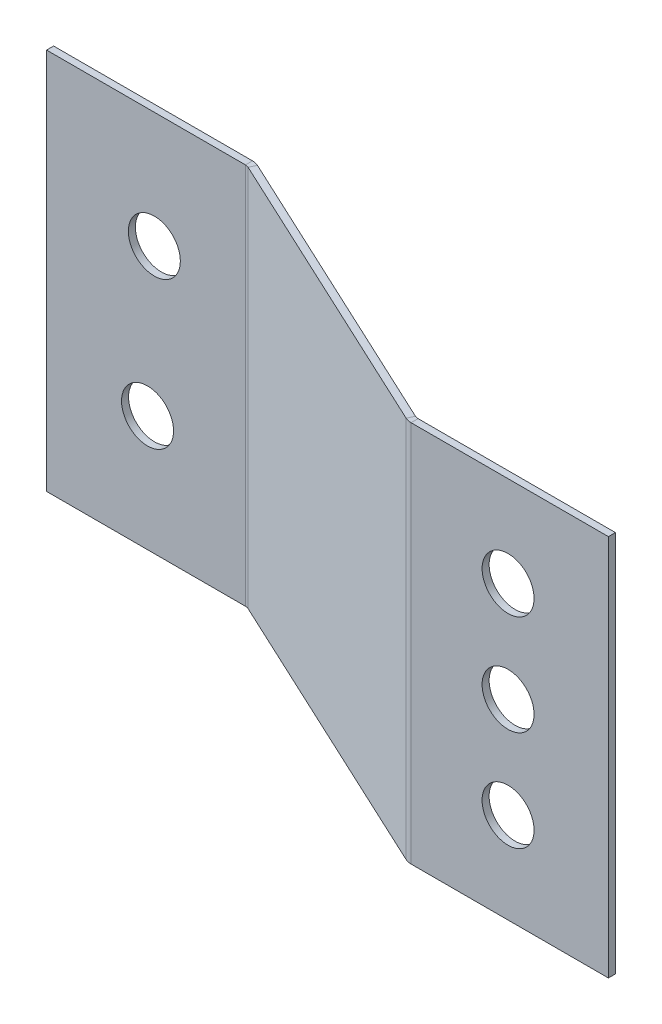
ISO-10303-21;
HEADER;
FILE_DESCRIPTION(('STEP AP214'),'2;1');
FILE_NAME('part.step','',(''),(''),'','','');
FILE_SCHEMA(('AUTOMOTIVE_DESIGN { 1 0 10303 214 1 1 1 1 }'));
ENDSEC;
DATA;
#1=APPLICATION_CONTEXT('core data for automotive mechanical design processes');
#2=APPLICATION_PROTOCOL_DEFINITION('international standard','automotive_design',2000,#1);
#3=PRODUCT_CONTEXT('',#1,'mechanical');
#4=PRODUCT('Part','Part','',(#3));
#5=PRODUCT_RELATED_PRODUCT_CATEGORY('part','',(#4));
#6=PRODUCT_DEFINITION_FORMATION('','',#4);
#7=PRODUCT_DEFINITION_CONTEXT('part definition',#1,'design');
#8=PRODUCT_DEFINITION('design','',#6,#7);
#9=PRODUCT_DEFINITION_SHAPE('','',#8);
#10=(LENGTH_UNIT() NAMED_UNIT(*) SI_UNIT(.MILLI.,.METRE.));
#11=(NAMED_UNIT(*) PLANE_ANGLE_UNIT() SI_UNIT($,.RADIAN.));
#12=(NAMED_UNIT(*) SI_UNIT($,.STERADIAN.) SOLID_ANGLE_UNIT());
#13=UNCERTAINTY_MEASURE_WITH_UNIT(LENGTH_MEASURE(1.E-05),#10,'distance_accuracy_value','');
#14=(GEOMETRIC_REPRESENTATION_CONTEXT(3) GLOBAL_UNCERTAINTY_ASSIGNED_CONTEXT((#13)) GLOBAL_UNIT_ASSIGNED_CONTEXT((#10,
#11,#12)) REPRESENTATION_CONTEXT('',''));
#15=CARTESIAN_POINT('',(0.,0.,0.));
#16=DIRECTION('',(0.,0.,1.));
#17=DIRECTION('',(1.,0.,0.));
#18=AXIS2_PLACEMENT_3D('',#15,#16,#17);
#19=CARTESIAN_POINT('',(-50.,38.1,-14.7));
#20=DIRECTION('',(0.,0.,1.));
#21=DIRECTION('',(1.,0.,0.));
#22=AXIS2_PLACEMENT_3D('',#19,#20,#21);
#23=PLANE('',#22);
#24=CARTESIAN_POINT('',(-59.9364336567589,11.55,-14.7));
#25=DIRECTION('',(0.,0.,-1.));
#26=DIRECTION('',(-1.,0.,0.));
#27=AXIS2_PLACEMENT_3D('',#24,#25,#26);
#28=CIRCLE('',#27,2.59079999999999);
#29=CARTESIAN_POINT('',(-62.5272336567589,11.55,-14.7));
#30=VERTEX_POINT('',#29);
#31=EDGE_CURVE('E347',#30,#30,#28,.T.);
#32=ORIENTED_EDGE('',*,*,#31,.F.);
#33=EDGE_LOOP('',(#32));
#34=FACE_BOUND('',#33,.T.);
#35=DIRECTION('',(1.,0.,0.));
#36=VECTOR('',#35,1.);
#37=CARTESIAN_POINT('',(-50.,0.,-14.7));
#38=LINE('',#37,#36);
#39=CARTESIAN_POINT('',(-50.1774794693996,0.,-14.7));
#40=VERTEX_POINT('',#39);
#41=CARTESIAN_POINT('',(-70.,0.,-14.7));
#42=VERTEX_POINT('',#41);
#43=EDGE_CURVE('E184',#40,#42,#38,.F.);
#44=ORIENTED_EDGE('',*,*,#43,.T.);
#45=DIRECTION('',(0.,-1.,0.));
#46=VECTOR('',#45,1.);
#47=CARTESIAN_POINT('',(-70.,38.1,-14.7));
#48=LINE('',#47,#46);
#49=CARTESIAN_POINT('',(-70.,38.1,-14.7));
#50=VERTEX_POINT('',#49);
#51=EDGE_CURVE('E259',#50,#42,#48,.T.);
#52=ORIENTED_EDGE('',*,*,#51,.F.);
#53=DIRECTION('',(1.,0.,0.));
#54=VECTOR('',#53,1.);
#55=CARTESIAN_POINT('',(-50.,38.1,-14.7));
#56=LINE('',#55,#54);
#57=CARTESIAN_POINT('',(-50.1774794693996,38.1,-14.7));
#58=VERTEX_POINT('',#57);
#59=EDGE_CURVE('E115',#58,#50,#56,.F.);
#60=ORIENTED_EDGE('',*,*,#59,.F.);
#61=DIRECTION('',(0.,-1.,0.));
#62=VECTOR('',#61,1.);
#63=CARTESIAN_POINT('',(-50.1774794693996,38.1,-14.7));
#64=LINE('',#63,#62);
#65=EDGE_CURVE('E180',#58,#40,#64,.T.);
#66=ORIENTED_EDGE('',*,*,#65,.T.);
#67=EDGE_LOOP('',(#44,#52,#60,#66));
#68=FACE_BOUND('',#67,.T.);
#69=CARTESIAN_POINT('',(-59.2593339432597,26.55,-14.7));
#70=DIRECTION('',(0.,0.,-1.));
#71=DIRECTION('',(-1.,0.,0.));
#72=AXIS2_PLACEMENT_3D('',#69,#70,#71);
#73=CIRCLE('',#72,2.59079999999999);
#74=CARTESIAN_POINT('',(-61.8501339432596,26.55,-14.7));
#75=VERTEX_POINT('',#74);
#76=EDGE_CURVE('E351',#75,#75,#73,.T.);
#77=ORIENTED_EDGE('',*,*,#76,.F.);
#78=EDGE_LOOP('',(#77));
#79=FACE_BOUND('',#78,.T.);
#80=ADVANCED_FACE('F42',(#34,#68,#79),#23,.F.);
#81=CARTESIAN_POINT('',(-20.3015541928724,38.1,-0.140725290007105));
#82=DIRECTION('',(0.,1.,0.));
#83=DIRECTION('',(0.,0.,1.));
#84=AXIS2_PLACEMENT_3D('',#81,#82,#83);
#85=PLANE('',#84);
#86=DIRECTION('',(0.422885465331124,0.,-0.906183139995266));
#87=VECTOR('',#86,1.);
#88=CARTESIAN_POINT('',(-20.3015541928724,38.1,-0.140725290007105));
#89=LINE('',#88,#87);
#90=CARTESIAN_POINT('',(-20.3015541928724,38.1,-0.140725290007105));
#91=VERTEX_POINT('',#90);
#92=CARTESIAN_POINT('',(-20.0055343671406,38.1,-0.775053488003791));
#93=VERTEX_POINT('',#92);
#94=EDGE_CURVE('E11',#91,#93,#89,.T.);
#95=ORIENTED_EDGE('',*,*,#94,.F.);
#96=CARTESIAN_POINT('',(-19.6672259948757,38.1,-1.5));
#97=DIRECTION('',(0.,1.,0.));
#98=DIRECTION('',(0.,0.,1.));
#99=AXIS2_PLACEMENT_3D('',#96,#97,#98);
#100=CIRCLE('',#99,1.5);
#101=CARTESIAN_POINT('',(-19.6672259948757,38.1,0.));
#102=VERTEX_POINT('',#101);
#103=EDGE_CURVE('E291',#102,#91,#100,.F.);
#104=ORIENTED_EDGE('',*,*,#103,.F.);
#105=DIRECTION('',(0.,0.,1.));
#106=VECTOR('',#105,1.);
#107=CARTESIAN_POINT('',(-19.6672259948757,38.1,-0.700000000000001));
#108=LINE('',#107,#106);
#109=CARTESIAN_POINT('',(-19.6672259948757,38.1,-0.700000000000001));
#110=VERTEX_POINT('',#109);
#111=EDGE_CURVE('E53',#110,#102,#108,.T.);
#112=ORIENTED_EDGE('',*,*,#111,.F.);
#113=CARTESIAN_POINT('',(-19.6672259948757,38.1,-1.5));
#114=DIRECTION('',(0.,1.,0.));
#115=DIRECTION('',(1.,0.,0.));
#116=AXIS2_PLACEMENT_3D('',#113,#114,#115);
#117=CIRCLE('',#116,0.8);
#118=EDGE_CURVE('E154',#110,#93,#117,.F.);
#119=ORIENTED_EDGE('',*,*,#118,.T.);
#120=EDGE_LOOP('',(#95,#104,#112,#119));
#121=FACE_BOUND('',#120,.T.);
#122=ADVANCED_FACE('F44',(#121),#85,.T.);
#123=CARTESIAN_POINT('',(-19.6672259948757,38.1,-0.700000000000001));
#124=DIRECTION('',(0.,1.,0.));
#125=DIRECTION('',(0.,0.,1.));
#126=AXIS2_PLACEMENT_3D('',#123,#124,#125);
#127=PLANE('',#126);
#128=DIRECTION('',(-0.906183139995265,0.,-0.422885465331124));
#129=VECTOR('',#128,1.);
#130=CARTESIAN_POINT('',(-20.,38.1,0.));
#131=LINE('',#130,#129);
#132=CARTESIAN_POINT('',(-49.8391710971347,38.1,-13.9249465119962));
#133=VERTEX_POINT('',#132);
#134=EDGE_CURVE('E148',#91,#133,#131,.T.);
#135=ORIENTED_EDGE('',*,*,#134,.F.);
#136=ORIENTED_EDGE('',*,*,#94,.T.);
#137=DIRECTION('',(-0.906183139995266,0.,-0.422885465331124));
#138=VECTOR('',#137,1.);
#139=CARTESIAN_POINT('',(-19.7039801742682,38.1,-0.634328197996683));
#140=LINE('',#139,#138);
#141=CARTESIAN_POINT('',(-49.5431512714029,38.1,-14.5592747099929));
#142=VERTEX_POINT('',#141);
#143=EDGE_CURVE('E145',#93,#142,#140,.T.);
#144=ORIENTED_EDGE('',*,*,#143,.T.);
#145=DIRECTION('',(-0.422885465331123,0.,0.906183139995266));
#146=VECTOR('',#145,1.);
#147=CARTESIAN_POINT('',(-49.5431512714029,38.1,-14.5592747099929));
#148=LINE('',#147,#146);
#149=EDGE_CURVE('E266',#142,#133,#148,.T.);
#150=ORIENTED_EDGE('',*,*,#149,.T.);
#151=EDGE_LOOP('',(#135,#136,#144,#150));
#152=FACE_BOUND('',#151,.T.);
#153=ADVANCED_FACE('F143',(#152),#127,.T.);
#154=CARTESIAN_POINT('',(-19.6672259948757,0.,0.));
#155=DIRECTION('',(0.,-1.,0.));
#156=DIRECTION('',(0.,0.,-1.));
#157=AXIS2_PLACEMENT_3D('',#154,#155,#156);
#158=PLANE('',#157);
#159=DIRECTION('',(0.,0.,-1.));
#160=VECTOR('',#159,1.);
#161=CARTESIAN_POINT('',(-19.6672259948757,0.,0.));
#162=LINE('',#161,#160);
#163=CARTESIAN_POINT('',(-19.6672259948757,0.,0.));
#164=VERTEX_POINT('',#163);
#165=CARTESIAN_POINT('',(-19.6672259948757,0.,-0.700000000000001));
#166=VERTEX_POINT('',#165);
#167=EDGE_CURVE('E274',#164,#166,#162,.T.);
#168=ORIENTED_EDGE('',*,*,#167,.F.);
#169=CARTESIAN_POINT('',(-19.6672259948757,0.,-1.5));
#170=DIRECTION('',(0.,1.,0.));
#171=DIRECTION('',(0.,0.,1.));
#172=AXIS2_PLACEMENT_3D('',#169,#170,#171);
#173=CIRCLE('',#172,1.5);
#174=CARTESIAN_POINT('',(-20.3015541928724,0.,-0.140725290007105));
#175=VERTEX_POINT('',#174);
#176=EDGE_CURVE('E203',#164,#175,#173,.F.);
#177=ORIENTED_EDGE('',*,*,#176,.T.);
#178=DIRECTION('',(-0.422885465331124,0.,0.906183139995266));
#179=VECTOR('',#178,1.);
#180=CARTESIAN_POINT('',(-20.0055343671406,0.,-0.775053488003791));
#181=LINE('',#180,#179);
#182=CARTESIAN_POINT('',(-20.0055343671406,0.,-0.775053488003791));
#183=VERTEX_POINT('',#182);
#184=EDGE_CURVE('E271',#183,#175,#181,.T.);
#185=ORIENTED_EDGE('',*,*,#184,.F.);
#186=CARTESIAN_POINT('',(-19.6672259948757,0.,-1.5));
#187=DIRECTION('',(0.,1.,0.));
#188=DIRECTION('',(1.,0.,0.));
#189=AXIS2_PLACEMENT_3D('',#186,#187,#188);
#190=CIRCLE('',#189,0.8);
#191=EDGE_CURVE('E167',#166,#183,#190,.F.);
#192=ORIENTED_EDGE('',*,*,#191,.F.);
#193=EDGE_LOOP('',(#168,#177,#185,#192));
#194=FACE_BOUND('',#193,.T.);
#195=ADVANCED_FACE('F384',(#194),#158,.T.);
#196=CARTESIAN_POINT('',(-20.0055343671406,0.,-0.775053488003791));
#197=DIRECTION('',(0.,-1.,0.));
#198=DIRECTION('',(0.,0.,-1.));
#199=AXIS2_PLACEMENT_3D('',#196,#197,#198);
#200=PLANE('',#199);
#201=DIRECTION('',(-1.,0.,0.));
#202=VECTOR('',#201,1.);
#203=CARTESIAN_POINT('',(0.,0.,0.));
#204=LINE('',#203,#202);
#205=CARTESIAN_POINT('',(0.,0.,0.));
#206=VERTEX_POINT('',#205);
#207=EDGE_CURVE('E207',#206,#164,#204,.T.);
#208=ORIENTED_EDGE('',*,*,#207,.T.);
#209=ORIENTED_EDGE('',*,*,#167,.T.);
#210=DIRECTION('',(-1.,0.,0.));
#211=VECTOR('',#210,1.);
#212=CARTESIAN_POINT('',(0.,0.,-0.7));
#213=LINE('',#212,#211);
#214=CARTESIAN_POINT('',(0.,0.,-0.7));
#215=VERTEX_POINT('',#214);
#216=EDGE_CURVE('E215',#215,#166,#213,.T.);
#217=ORIENTED_EDGE('',*,*,#216,.F.);
#218=DIRECTION('',(0.,0.,1.));
#219=VECTOR('',#218,1.);
#220=CARTESIAN_POINT('',(0.,0.,-0.7));
#221=LINE('',#220,#219);
#222=EDGE_CURVE('E211',#215,#206,#221,.T.);
#223=ORIENTED_EDGE('',*,*,#222,.T.);
#224=EDGE_LOOP('',(#208,#209,#217,#223));
#225=FACE_BOUND('',#224,.T.);
#226=ADVANCED_FACE('F387',(#225),#200,.T.);
#227=CARTESIAN_POINT('',(-50.1774794693996,38.1,-14.));
#228=DIRECTION('',(0.,1.,0.));
#229=DIRECTION('',(0.,0.,1.));
#230=AXIS2_PLACEMENT_3D('',#227,#228,#229);
#231=PLANE('',#230);
#232=DIRECTION('',(0.,0.,-1.));
#233=VECTOR('',#232,1.);
#234=CARTESIAN_POINT('',(-50.1774794693996,38.1,-14.));
#235=LINE('',#234,#233);
#236=CARTESIAN_POINT('',(-50.1774794693996,38.1,-14.));
#237=VERTEX_POINT('',#236);
#238=EDGE_CURVE('E61',#237,#58,#235,.T.);
#239=ORIENTED_EDGE('',*,*,#238,.F.);
#240=CARTESIAN_POINT('',(-50.1774794693996,38.1,-13.2));
#241=DIRECTION('',(0.,-1.,0.));
#242=DIRECTION('',(0.,0.,-1.));
#243=AXIS2_PLACEMENT_3D('',#240,#241,#242);
#244=CIRCLE('',#243,0.8);
#245=EDGE_CURVE('E306',#133,#237,#244,.F.);
#246=ORIENTED_EDGE('',*,*,#245,.F.);
#247=ORIENTED_EDGE('',*,*,#149,.F.);
#248=CARTESIAN_POINT('',(-50.1774794693996,38.1,-13.2));
#249=DIRECTION('',(0.,1.,0.));
#250=DIRECTION('',(1.,0.,0.));
#251=AXIS2_PLACEMENT_3D('',#248,#249,#250);
#252=CIRCLE('',#251,1.5);
#253=EDGE_CURVE('E177',#142,#58,#252,.T.);
#254=ORIENTED_EDGE('',*,*,#253,.T.);
#255=EDGE_LOOP('',(#239,#246,#247,#254));
#256=FACE_BOUND('',#255,.T.);
#257=ADVANCED_FACE('F420',(#256),#231,.T.);
#258=CARTESIAN_POINT('',(-49.5431512714029,38.1,-14.5592747099929));
#259=DIRECTION('',(0.,1.,0.));
#260=DIRECTION('',(0.,0.,1.));
#261=AXIS2_PLACEMENT_3D('',#258,#259,#260);
#262=PLANE('',#261);
#263=DIRECTION('',(-1.,0.,0.));
#264=VECTOR('',#263,1.);
#265=CARTESIAN_POINT('',(-50.,38.1,-14.));
#266=LINE('',#265,#264);
#267=CARTESIAN_POINT('',(-70.,38.1,-14.));
#268=VERTEX_POINT('',#267);
#269=EDGE_CURVE('E310',#237,#268,#266,.T.);
#270=ORIENTED_EDGE('',*,*,#269,.F.);
#271=ORIENTED_EDGE('',*,*,#238,.T.);
#272=ORIENTED_EDGE('',*,*,#59,.T.);
#273=DIRECTION('',(0.,0.,-1.));
#274=VECTOR('',#273,1.);
#275=CARTESIAN_POINT('',(-70.,38.1,-14.));
#276=LINE('',#275,#274);
#277=EDGE_CURVE('E314',#268,#50,#276,.T.);
#278=ORIENTED_EDGE('',*,*,#277,.F.);
#279=EDGE_LOOP('',(#270,#271,#272,#278));
#280=FACE_BOUND('',#279,.T.);
#281=ADVANCED_FACE('F417',(#280),#262,.T.);
#282=CARTESIAN_POINT('',(-49.8391710971347,0.,-13.9249465119962));
#283=DIRECTION('',(0.,-1.,0.));
#284=DIRECTION('',(0.,0.,-1.));
#285=AXIS2_PLACEMENT_3D('',#282,#283,#284);
#286=PLANE('',#285);
#287=DIRECTION('',(0.422885465331123,0.,-0.906183139995266));
#288=VECTOR('',#287,1.);
#289=CARTESIAN_POINT('',(-49.8391710971347,0.,-13.9249465119962));
#290=LINE('',#289,#288);
#291=CARTESIAN_POINT('',(-49.8391710971347,0.,-13.9249465119962));
#292=VERTEX_POINT('',#291);
#293=CARTESIAN_POINT('',(-49.5431512714029,0.,-14.5592747099929));
#294=VERTEX_POINT('',#293);
#295=EDGE_CURVE('E102',#292,#294,#290,.T.);
#296=ORIENTED_EDGE('',*,*,#295,.F.);
#297=CARTESIAN_POINT('',(-50.1774794693996,0.,-13.2));
#298=DIRECTION('',(0.,-1.,0.));
#299=DIRECTION('',(0.,0.,-1.));
#300=AXIS2_PLACEMENT_3D('',#297,#298,#299);
#301=CIRCLE('',#300,0.8);
#302=CARTESIAN_POINT('',(-50.1774794693996,0.,-14.));
#303=VERTEX_POINT('',#302);
#304=EDGE_CURVE('E197',#292,#303,#301,.F.);
#305=ORIENTED_EDGE('',*,*,#304,.T.);
#306=DIRECTION('',(0.,0.,1.));
#307=VECTOR('',#306,1.);
#308=CARTESIAN_POINT('',(-50.1774794693996,0.,-14.7));
#309=LINE('',#308,#307);
#310=EDGE_CURVE('E109',#40,#303,#309,.T.);
#311=ORIENTED_EDGE('',*,*,#310,.F.);
#312=CARTESIAN_POINT('',(-50.1774794693996,0.,-13.2));
#313=DIRECTION('',(0.,1.,0.));
#314=DIRECTION('',(1.,0.,0.));
#315=AXIS2_PLACEMENT_3D('',#312,#313,#314);
#316=CIRCLE('',#315,1.5);
#317=EDGE_CURVE('E224',#294,#40,#316,.T.);
#318=ORIENTED_EDGE('',*,*,#317,.F.);
#319=EDGE_LOOP('',(#296,#305,#311,#318));
#320=FACE_BOUND('',#319,.T.);
#321=ADVANCED_FACE('F375',(#320),#286,.T.);
#322=CARTESIAN_POINT('',(-50.1774794693996,0.,-14.7));
#323=DIRECTION('',(0.,-1.,0.));
#324=DIRECTION('',(0.,0.,-1.));
#325=AXIS2_PLACEMENT_3D('',#322,#323,#324);
#326=PLANE('',#325);
#327=DIRECTION('',(-0.906183139995265,0.,-0.422885465331124));
#328=VECTOR('',#327,1.);
#329=CARTESIAN_POINT('',(-20.,0.,0.));
#330=LINE('',#329,#328);
#331=EDGE_CURVE('E200',#175,#292,#330,.T.);
#332=ORIENTED_EDGE('',*,*,#331,.T.);
#333=ORIENTED_EDGE('',*,*,#295,.T.);
#334=DIRECTION('',(-0.906183139995266,0.,-0.422885465331124));
#335=VECTOR('',#334,1.);
#336=CARTESIAN_POINT('',(-19.7039801742682,0.,-0.634328197996683));
#337=LINE('',#336,#335);
#338=EDGE_CURVE('E221',#183,#294,#337,.T.);
#339=ORIENTED_EDGE('',*,*,#338,.F.);
#340=ORIENTED_EDGE('',*,*,#184,.T.);
#341=EDGE_LOOP('',(#332,#333,#339,#340));
#342=FACE_BOUND('',#341,.T.);
#343=ADVANCED_FACE('F380',(#342),#326,.T.);
#344=CARTESIAN_POINT('',(-70.,38.1,-14.));
#345=DIRECTION('',(-1.,0.,0.));
#346=DIRECTION('',(0.,0.,1.));
#347=AXIS2_PLACEMENT_3D('',#344,#345,#346);
#348=PLANE('',#347);
#349=DIRECTION('',(0.,0.,-1.));
#350=VECTOR('',#349,1.);
#351=CARTESIAN_POINT('',(-70.,0.,-14.));
#352=LINE('',#351,#350);
#353=CARTESIAN_POINT('',(-70.,0.,-14.));
#354=VERTEX_POINT('',#353);
#355=EDGE_CURVE('E188',#354,#42,#352,.T.);
#356=ORIENTED_EDGE('',*,*,#355,.F.);
#357=DIRECTION('',(0.,-1.,0.));
#358=VECTOR('',#357,1.);
#359=CARTESIAN_POINT('',(-70.,38.1,-14.));
#360=LINE('',#359,#358);
#361=EDGE_CURVE('E256',#268,#354,#360,.T.);
#362=ORIENTED_EDGE('',*,*,#361,.F.);
#363=ORIENTED_EDGE('',*,*,#277,.T.);
#364=ORIENTED_EDGE('',*,*,#51,.T.);
#365=EDGE_LOOP('',(#356,#362,#363,#364));
#366=FACE_BOUND('',#365,.T.);
#367=ADVANCED_FACE('F366',(#366),#348,.T.);
#368=CARTESIAN_POINT('',(-50.,38.1,-14.));
#369=DIRECTION('',(0.,0.,1.));
#370=DIRECTION('',(1.,0.,0.));
#371=AXIS2_PLACEMENT_3D('',#368,#369,#370);
#372=PLANE('',#371);
#373=CARTESIAN_POINT('',(-59.2593339432597,26.55,-14.));
#374=DIRECTION('',(0.,0.,1.));
#375=DIRECTION('',(1.,0.,0.));
#376=AXIS2_PLACEMENT_3D('',#373,#374,#375);
#377=CIRCLE('',#376,2.59079999999999);
#378=CARTESIAN_POINT('',(-56.6685339432597,26.55,-14.));
#379=VERTEX_POINT('',#378);
#380=EDGE_CURVE('E46',#379,#379,#377,.T.);
#381=ORIENTED_EDGE('',*,*,#380,.F.);
#382=EDGE_LOOP('',(#381));
#383=FACE_BOUND('',#382,.T.);
#384=CARTESIAN_POINT('',(-59.9364336567589,11.55,-14.));
#385=DIRECTION('',(0.,0.,1.));
#386=DIRECTION('',(1.,0.,0.));
#387=AXIS2_PLACEMENT_3D('',#384,#385,#386);
#388=CIRCLE('',#387,2.59079999999999);
#389=CARTESIAN_POINT('',(-57.3456336567589,11.55,-14.));
#390=VERTEX_POINT('',#389);
#391=EDGE_CURVE('E343',#390,#390,#388,.T.);
#392=ORIENTED_EDGE('',*,*,#391,.F.);
#393=EDGE_LOOP('',(#392));
#394=FACE_BOUND('',#393,.T.);
#395=DIRECTION('',(-1.,0.,0.));
#396=VECTOR('',#395,1.);
#397=CARTESIAN_POINT('',(-50.,0.,-14.));
#398=LINE('',#397,#396);
#399=EDGE_CURVE('E193',#303,#354,#398,.T.);
#400=ORIENTED_EDGE('',*,*,#399,.F.);
#401=DIRECTION('',(0.,-1.,0.));
#402=VECTOR('',#401,1.);
#403=CARTESIAN_POINT('',(-50.1774794693996,38.1,-14.));
#404=LINE('',#403,#402);
#405=EDGE_CURVE('E252',#237,#303,#404,.T.);
#406=ORIENTED_EDGE('',*,*,#405,.F.);
#407=ORIENTED_EDGE('',*,*,#269,.T.);
#408=ORIENTED_EDGE('',*,*,#361,.T.);
#409=EDGE_LOOP('',(#400,#406,#407,#408));
#410=FACE_BOUND('',#409,.T.);
#411=ADVANCED_FACE('F362',(#383,#394,#410),#372,.T.);
#412=CARTESIAN_POINT('',(-50.1774794693996,38.1,-13.2));
#413=DIRECTION('',(0.,-1.,0.));
#414=DIRECTION('',(0.,0.,-1.));
#415=AXIS2_PLACEMENT_3D('',#412,#413,#414);
#416=CYLINDRICAL_SURFACE('',#415,0.8);
#417=ORIENTED_EDGE('',*,*,#304,.F.);
#418=DIRECTION('',(0.,-1.,0.));
#419=VECTOR('',#418,1.);
#420=CARTESIAN_POINT('',(-49.8391710971347,38.1,-13.9249465119962));
#421=LINE('',#420,#419);
#422=EDGE_CURVE('E248',#133,#292,#421,.T.);
#423=ORIENTED_EDGE('',*,*,#422,.F.);
#424=ORIENTED_EDGE('',*,*,#245,.T.);
#425=ORIENTED_EDGE('',*,*,#405,.T.);
#426=EDGE_LOOP('',(#417,#423,#424,#425));
#427=FACE_BOUND('',#426,.T.);
#428=ADVANCED_FACE('F365',(#427),#416,.F.);
#429=CARTESIAN_POINT('',(-20.,38.1,0.));
#430=DIRECTION('',(-0.422885465331124,0.,0.906183139995266));
#431=DIRECTION('',(0.906183139995266,0.,0.422885465331124));
#432=AXIS2_PLACEMENT_3D('',#429,#430,#431);
#433=PLANE('',#432);
#434=ORIENTED_EDGE('',*,*,#331,.F.);
#435=DIRECTION('',(0.,-1.,0.));
#436=VECTOR('',#435,1.);
#437=CARTESIAN_POINT('',(-20.3015541928724,38.1,-0.140725290007105));
#438=LINE('',#437,#436);
#439=EDGE_CURVE('E244',#91,#175,#438,.T.);
#440=ORIENTED_EDGE('',*,*,#439,.F.);
#441=ORIENTED_EDGE('',*,*,#134,.T.);
#442=ORIENTED_EDGE('',*,*,#422,.T.);
#443=EDGE_LOOP('',(#434,#440,#441,#442));
#444=FACE_BOUND('',#443,.T.);
#445=ADVANCED_FACE('F382',(#444),#433,.T.);
#446=CARTESIAN_POINT('',(-19.6672259948757,38.1,-1.5));
#447=DIRECTION('',(0.,-1.,0.));
#448=DIRECTION('',(0.,0.,-1.));
#449=AXIS2_PLACEMENT_3D('',#446,#447,#448);
#450=CYLINDRICAL_SURFACE('',#449,1.5);
#451=ORIENTED_EDGE('',*,*,#176,.F.);
#452=DIRECTION('',(0.,-1.,0.));
#453=VECTOR('',#452,1.);
#454=CARTESIAN_POINT('',(-19.6672259948757,38.1,0.));
#455=LINE('',#454,#453);
#456=EDGE_CURVE('E240',#102,#164,#455,.T.);
#457=ORIENTED_EDGE('',*,*,#456,.F.);
#458=ORIENTED_EDGE('',*,*,#103,.T.);
#459=ORIENTED_EDGE('',*,*,#439,.T.);
#460=EDGE_LOOP('',(#451,#457,#458,#459));
#461=FACE_BOUND('',#460,.T.);
#462=ADVANCED_FACE('F290',(#461),#450,.T.);
#463=CARTESIAN_POINT('',(0.,38.1,0.));
#464=DIRECTION('',(0.,0.,1.));
#465=DIRECTION('',(1.,0.,0.));
#466=AXIS2_PLACEMENT_3D('',#463,#464,#465);
#467=PLANE('',#466);
#468=CARTESIAN_POINT('',(-10.,29.05,0.));
#469=DIRECTION('',(0.,0.,-1.));
#470=DIRECTION('',(-1.,0.,0.));
#471=AXIS2_PLACEMENT_3D('',#468,#469,#470);
#472=CIRCLE('',#471,2.5908);
#473=CARTESIAN_POINT('',(-12.5908,29.05,0.));
#474=VERTEX_POINT('',#473);
#475=EDGE_CURVE('E335',#474,#474,#472,.T.);
#476=ORIENTED_EDGE('',*,*,#475,.T.);
#477=EDGE_LOOP('',(#476));
#478=FACE_BOUND('',#477,.T.);
#479=CARTESIAN_POINT('',(-10.,19.05,0.));
#480=DIRECTION('',(0.,0.,-1.));
#481=DIRECTION('',(-1.,0.,0.));
#482=AXIS2_PLACEMENT_3D('',#479,#480,#481);
#483=CIRCLE('',#482,2.5908);
#484=CARTESIAN_POINT('',(-12.5908,19.05,0.));
#485=VERTEX_POINT('',#484);
#486=EDGE_CURVE('E327',#485,#485,#483,.T.);
#487=ORIENTED_EDGE('',*,*,#486,.T.);
#488=EDGE_LOOP('',(#487));
#489=FACE_BOUND('',#488,.T.);
#490=CARTESIAN_POINT('',(-10.,9.05,0.));
#491=DIRECTION('',(0.,0.,-1.));
#492=DIRECTION('',(-1.,0.,0.));
#493=AXIS2_PLACEMENT_3D('',#490,#491,#492);
#494=CIRCLE('',#493,2.5908);
#495=CARTESIAN_POINT('',(-12.5908,9.05,0.));
#496=VERTEX_POINT('',#495);
#497=EDGE_CURVE('E189',#496,#496,#494,.T.);
#498=ORIENTED_EDGE('',*,*,#497,.T.);
#499=EDGE_LOOP('',(#498));
#500=FACE_BOUND('',#499,.T.);
#501=ORIENTED_EDGE('',*,*,#207,.F.);
#502=DIRECTION('',(0.,-1.,0.));
#503=VECTOR('',#502,1.);
#504=CARTESIAN_POINT('',(0.,38.1,0.));
#505=LINE('',#504,#503);
#506=CARTESIAN_POINT('',(0.,38.1,0.));
#507=VERTEX_POINT('',#506);
#508=EDGE_CURVE('E237',#507,#206,#505,.T.);
#509=ORIENTED_EDGE('',*,*,#508,.F.);
#510=DIRECTION('',(-1.,0.,0.));
#511=VECTOR('',#510,1.);
#512=CARTESIAN_POINT('',(0.,38.1,0.));
#513=LINE('',#512,#511);
#514=EDGE_CURVE('E284',#507,#102,#513,.T.);
#515=ORIENTED_EDGE('',*,*,#514,.T.);
#516=ORIENTED_EDGE('',*,*,#456,.T.);
#517=EDGE_LOOP('',(#501,#509,#515,#516));
#518=FACE_BOUND('',#517,.T.);
#519=ADVANCED_FACE('F296',(#478,#489,#500,#518),#467,.T.);
#520=CARTESIAN_POINT('',(0.,38.1,-0.7));
#521=DIRECTION('',(1.,0.,0.));
#522=DIRECTION('',(0.,0.,-1.));
#523=AXIS2_PLACEMENT_3D('',#520,#521,#522);
#524=PLANE('',#523);
#525=ORIENTED_EDGE('',*,*,#222,.F.);
#526=DIRECTION('',(0.,-1.,0.));
#527=VECTOR('',#526,1.);
#528=CARTESIAN_POINT('',(0.,38.1,-0.7));
#529=LINE('',#528,#527);
#530=CARTESIAN_POINT('',(0.,38.1,-0.7));
#531=VERTEX_POINT('',#530);
#532=EDGE_CURVE('E234',#531,#215,#529,.T.);
#533=ORIENTED_EDGE('',*,*,#532,.F.);
#534=DIRECTION('',(0.,0.,1.));
#535=VECTOR('',#534,1.);
#536=CARTESIAN_POINT('',(0.,38.1,-0.7));
#537=LINE('',#536,#535);
#538=EDGE_CURVE('E298',#531,#507,#537,.T.);
#539=ORIENTED_EDGE('',*,*,#538,.T.);
#540=ORIENTED_EDGE('',*,*,#508,.T.);
#541=EDGE_LOOP('',(#525,#533,#539,#540));
#542=FACE_BOUND('',#541,.T.);
#543=ADVANCED_FACE('F392',(#542),#524,.T.);
#544=CARTESIAN_POINT('',(0.,38.1,-0.7));
#545=DIRECTION('',(0.,0.,1.));
#546=DIRECTION('',(1.,0.,0.));
#547=AXIS2_PLACEMENT_3D('',#544,#545,#546);
#548=PLANE('',#547);
#549=CARTESIAN_POINT('',(-10.,29.05,-0.7));
#550=DIRECTION('',(0.,0.,-1.));
#551=DIRECTION('',(-1.,0.,0.));
#552=AXIS2_PLACEMENT_3D('',#549,#550,#551);
#553=CIRCLE('',#552,2.5908);
#554=CARTESIAN_POINT('',(-12.5908,29.05,-0.7));
#555=VERTEX_POINT('',#554);
#556=EDGE_CURVE('E339',#555,#555,#553,.T.);
#557=ORIENTED_EDGE('',*,*,#556,.F.);
#558=EDGE_LOOP('',(#557));
#559=FACE_BOUND('',#558,.T.);
#560=CARTESIAN_POINT('',(-10.,19.05,-0.7));
#561=DIRECTION('',(0.,0.,-1.));
#562=DIRECTION('',(-1.,0.,0.));
#563=AXIS2_PLACEMENT_3D('',#560,#561,#562);
#564=CIRCLE('',#563,2.5908);
#565=CARTESIAN_POINT('',(-12.5908,19.05,-0.7));
#566=VERTEX_POINT('',#565);
#567=EDGE_CURVE('E331',#566,#566,#564,.T.);
#568=ORIENTED_EDGE('',*,*,#567,.F.);
#569=EDGE_LOOP('',(#568));
#570=FACE_BOUND('',#569,.T.);
#571=CARTESIAN_POINT('',(-10.,9.05,-0.7));
#572=DIRECTION('',(0.,0.,-1.));
#573=DIRECTION('',(-1.,0.,0.));
#574=AXIS2_PLACEMENT_3D('',#571,#572,#573);
#575=CIRCLE('',#574,2.5908);
#576=CARTESIAN_POINT('',(-12.5908,9.05,-0.7));
#577=VERTEX_POINT('',#576);
#578=EDGE_CURVE('E323',#577,#577,#575,.T.);
#579=ORIENTED_EDGE('',*,*,#578,.F.);
#580=EDGE_LOOP('',(#579));
#581=FACE_BOUND('',#580,.T.);
#582=ORIENTED_EDGE('',*,*,#216,.T.);
#583=DIRECTION('',(0.,-1.,0.));
#584=VECTOR('',#583,1.);
#585=CARTESIAN_POINT('',(-19.6672259948757,38.1,-0.700000000000001));
#586=LINE('',#585,#584);
#587=EDGE_CURVE('E170',#110,#166,#586,.T.);
#588=ORIENTED_EDGE('',*,*,#587,.F.);
#589=DIRECTION('',(-1.,0.,0.));
#590=VECTOR('',#589,1.);
#591=CARTESIAN_POINT('',(0.,38.1,-0.7));
#592=LINE('',#591,#590);
#593=EDGE_CURVE('E160',#531,#110,#592,.T.);
#594=ORIENTED_EDGE('',*,*,#593,.F.);
#595=ORIENTED_EDGE('',*,*,#532,.T.);
#596=EDGE_LOOP('',(#582,#588,#594,#595));
#597=FACE_BOUND('',#596,.T.);
#598=ADVANCED_FACE('F390',(#559,#570,#581,#597),#548,.F.);
#599=CARTESIAN_POINT('',(-19.6672259948757,38.1,-1.5));
#600=DIRECTION('',(0.,-1.,0.));
#601=DIRECTION('',(0.,0.,-1.));
#602=AXIS2_PLACEMENT_3D('',#599,#600,#601);
#603=CYLINDRICAL_SURFACE('',#602,0.8);
#604=ORIENTED_EDGE('',*,*,#191,.T.);
#605=DIRECTION('',(0.,-1.,0.));
#606=VECTOR('',#605,1.);
#607=CARTESIAN_POINT('',(-20.0055343671406,38.1,-0.775053488003791));
#608=LINE('',#607,#606);
#609=EDGE_CURVE('E164',#93,#183,#608,.T.);
#610=ORIENTED_EDGE('',*,*,#609,.F.);
#611=ORIENTED_EDGE('',*,*,#118,.F.);
#612=ORIENTED_EDGE('',*,*,#587,.T.);
#613=EDGE_LOOP('',(#604,#610,#611,#612));
#614=FACE_BOUND('',#613,.T.);
#615=ADVANCED_FACE('F165',(#614),#603,.F.);
#616=CARTESIAN_POINT('',(-19.7039801742682,38.1,-0.634328197996683));
#617=DIRECTION('',(-0.422885465331124,0.,0.906183139995265));
#618=DIRECTION('',(0.906183139995266,0.,0.422885465331124));
#619=AXIS2_PLACEMENT_3D('',#616,#617,#618);
#620=PLANE('',#619);
#621=ORIENTED_EDGE('',*,*,#338,.T.);
#622=DIRECTION('',(0.,-1.,0.));
#623=VECTOR('',#622,1.);
#624=CARTESIAN_POINT('',(-49.5431512714029,38.1,-14.5592747099929));
#625=LINE('',#624,#623);
#626=EDGE_CURVE('E171',#142,#294,#625,.T.);
#627=ORIENTED_EDGE('',*,*,#626,.F.);
#628=ORIENTED_EDGE('',*,*,#143,.F.);
#629=ORIENTED_EDGE('',*,*,#609,.T.);
#630=EDGE_LOOP('',(#621,#627,#628,#629));
#631=FACE_BOUND('',#630,.T.);
#632=ADVANCED_FACE('F173',(#631),#620,.F.);
#633=CARTESIAN_POINT('',(-50.1774794693996,38.1,-13.2));
#634=DIRECTION('',(0.,-1.,0.));
#635=DIRECTION('',(0.,0.,-1.));
#636=AXIS2_PLACEMENT_3D('',#633,#634,#635);
#637=CYLINDRICAL_SURFACE('',#636,1.5);
#638=ORIENTED_EDGE('',*,*,#317,.T.);
#639=ORIENTED_EDGE('',*,*,#65,.F.);
#640=ORIENTED_EDGE('',*,*,#253,.F.);
#641=ORIENTED_EDGE('',*,*,#626,.T.);
#642=EDGE_LOOP('',(#638,#639,#640,#641));
#643=FACE_BOUND('',#642,.T.);
#644=ADVANCED_FACE('F578',(#643),#637,.T.);
#645=CARTESIAN_POINT('',(-50.1774794693996,38.1,-13.2));
#646=DIRECTION('',(0.,-1.,0.));
#647=DIRECTION('',(-1.,0.,0.));
#648=AXIS2_PLACEMENT_3D('',#645,#646,#647);
#649=PLANE('',#648);
#650=ORIENTED_EDGE('',*,*,#593,.T.);
#651=ORIENTED_EDGE('',*,*,#111,.T.);
#652=ORIENTED_EDGE('',*,*,#514,.F.);
#653=ORIENTED_EDGE('',*,*,#538,.F.);
#654=EDGE_LOOP('',(#650,#651,#652,#653));
#655=FACE_BOUND('',#654,.T.);
#656=ADVANCED_FACE('F281',(#655),#649,.F.);
#657=CARTESIAN_POINT('',(-50.1774794693996,0.,-13.2));
#658=DIRECTION('',(0.,-1.,0.));
#659=DIRECTION('',(-1.,0.,0.));
#660=AXIS2_PLACEMENT_3D('',#657,#658,#659);
#661=PLANE('',#660);
#662=ORIENTED_EDGE('',*,*,#43,.F.);
#663=ORIENTED_EDGE('',*,*,#310,.T.);
#664=ORIENTED_EDGE('',*,*,#399,.T.);
#665=ORIENTED_EDGE('',*,*,#355,.T.);
#666=EDGE_LOOP('',(#662,#663,#664,#665));
#667=FACE_BOUND('',#666,.T.);
#668=ADVANCED_FACE('F497',(#667),#661,.T.);
#669=CARTESIAN_POINT('',(-10.,9.05,-0.7));
#670=DIRECTION('',(0.,0.,-1.));
#671=DIRECTION('',(-1.,0.,0.));
#672=AXIS2_PLACEMENT_3D('',#669,#670,#671);
#673=CYLINDRICAL_SURFACE('',#672,2.5908);
#674=ORIENTED_EDGE('',*,*,#497,.F.);
#675=EDGE_LOOP('',(#674));
#676=FACE_BOUND('',#675,.T.);
#677=ORIENTED_EDGE('',*,*,#578,.T.);
#678=EDGE_LOOP('',(#677));
#679=FACE_BOUND('',#678,.T.);
#680=ADVANCED_FACE('F511',(#676,#679),#673,.F.);
#681=CARTESIAN_POINT('',(-10.,19.05,-0.7));
#682=DIRECTION('',(0.,0.,-1.));
#683=DIRECTION('',(-1.,0.,0.));
#684=AXIS2_PLACEMENT_3D('',#681,#682,#683);
#685=CYLINDRICAL_SURFACE('',#684,2.5908);
#686=ORIENTED_EDGE('',*,*,#486,.F.);
#687=EDGE_LOOP('',(#686));
#688=FACE_BOUND('',#687,.T.);
#689=ORIENTED_EDGE('',*,*,#567,.T.);
#690=EDGE_LOOP('',(#689));
#691=FACE_BOUND('',#690,.T.);
#692=ADVANCED_FACE('F516',(#688,#691),#685,.F.);
#693=CARTESIAN_POINT('',(-10.,29.05,-0.7));
#694=DIRECTION('',(0.,0.,-1.));
#695=DIRECTION('',(-1.,0.,0.));
#696=AXIS2_PLACEMENT_3D('',#693,#694,#695);
#697=CYLINDRICAL_SURFACE('',#696,2.5908);
#698=ORIENTED_EDGE('',*,*,#475,.F.);
#699=EDGE_LOOP('',(#698));
#700=FACE_BOUND('',#699,.T.);
#701=ORIENTED_EDGE('',*,*,#556,.T.);
#702=EDGE_LOOP('',(#701));
#703=FACE_BOUND('',#702,.T.);
#704=ADVANCED_FACE('F526',(#700,#703),#697,.F.);
#705=CARTESIAN_POINT('',(-59.9364336567589,11.55,-14.7));
#706=DIRECTION('',(0.,0.,-1.));
#707=DIRECTION('',(-1.,0.,0.));
#708=AXIS2_PLACEMENT_3D('',#705,#706,#707);
#709=CYLINDRICAL_SURFACE('',#708,2.59079999999999);
#710=ORIENTED_EDGE('',*,*,#391,.T.);
#711=EDGE_LOOP('',(#710));
#712=FACE_BOUND('',#711,.T.);
#713=ORIENTED_EDGE('',*,*,#31,.T.);
#714=EDGE_LOOP('',(#713));
#715=FACE_BOUND('',#714,.T.);
#716=ADVANCED_FACE('F535',(#712,#715),#709,.F.);
#717=CARTESIAN_POINT('',(-59.2593339432597,26.55,-14.7));
#718=DIRECTION('',(0.,0.,-1.));
#719=DIRECTION('',(-1.,0.,0.));
#720=AXIS2_PLACEMENT_3D('',#717,#718,#719);
#721=CYLINDRICAL_SURFACE('',#720,2.59079999999999);
#722=ORIENTED_EDGE('',*,*,#380,.T.);
#723=EDGE_LOOP('',(#722));
#724=FACE_BOUND('',#723,.T.);
#725=ORIENTED_EDGE('',*,*,#76,.T.);
#726=EDGE_LOOP('',(#725));
#727=FACE_BOUND('',#726,.T.);
#728=ADVANCED_FACE('F360',(#724,#727),#721,.F.);
#729=CLOSED_SHELL('',(#80,#122,#153,#195,#226,#257,#281,#321,#343,#367,#411,#428,#445,#462,#519,
#543,#598,#615,#632,#644,#656,#668,#680,#692,#704,#716,#728));
#730=MANIFOLD_SOLID_BREP('B2',#729);
#731=ADVANCED_BREP_SHAPE_REPRESENTATION('',(#18,#730),#14);
#732=SHAPE_DEFINITION_REPRESENTATION(#9,#731);
ENDSEC;
END-ISO-10303-21;
